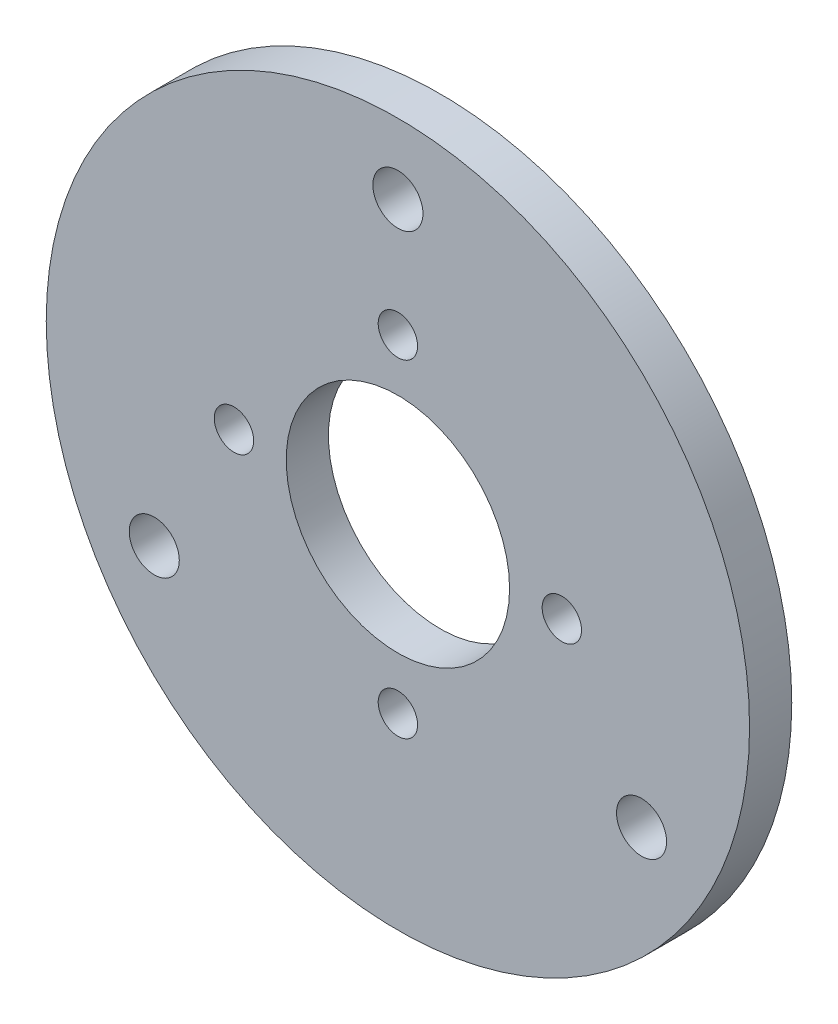
ISO-10303-21;
HEADER;
FILE_DESCRIPTION(('STEP AP214'),'2;1');
FILE_NAME('part.step','',(''),(''),'','','');
FILE_SCHEMA(('AUTOMOTIVE_DESIGN { 1 0 10303 214 1 1 1 1 }'));
ENDSEC;
DATA;
#1=APPLICATION_CONTEXT('core data for automotive mechanical design processes');
#2=APPLICATION_PROTOCOL_DEFINITION('international standard','automotive_design',2000,#1);
#3=PRODUCT_CONTEXT('',#1,'mechanical');
#4=PRODUCT('Part','Part','',(#3));
#5=PRODUCT_RELATED_PRODUCT_CATEGORY('part','',(#4));
#6=PRODUCT_DEFINITION_FORMATION('','',#4);
#7=PRODUCT_DEFINITION_CONTEXT('part definition',#1,'design');
#8=PRODUCT_DEFINITION('design','',#6,#7);
#9=PRODUCT_DEFINITION_SHAPE('','',#8);
#10=(LENGTH_UNIT() NAMED_UNIT(*) SI_UNIT(.MILLI.,.METRE.));
#11=(NAMED_UNIT(*) PLANE_ANGLE_UNIT() SI_UNIT($,.RADIAN.));
#12=(NAMED_UNIT(*) SI_UNIT($,.STERADIAN.) SOLID_ANGLE_UNIT());
#13=UNCERTAINTY_MEASURE_WITH_UNIT(LENGTH_MEASURE(1.E-05),#10,'distance_accuracy_value','');
#14=(GEOMETRIC_REPRESENTATION_CONTEXT(3) GLOBAL_UNCERTAINTY_ASSIGNED_CONTEXT((#13)) GLOBAL_UNIT_ASSIGNED_CONTEXT((#10,
#11,#12)) REPRESENTATION_CONTEXT('',''));
#15=CARTESIAN_POINT('',(0.,0.,0.));
#16=DIRECTION('',(0.,0.,1.));
#17=DIRECTION('',(1.,0.,0.));
#18=AXIS2_PLACEMENT_3D('',#15,#16,#17);
#19=CARTESIAN_POINT('',(0.,0.,1.905));
#20=DIRECTION('',(0.,0.,1.));
#21=DIRECTION('',(1.,0.,0.));
#22=AXIS2_PLACEMENT_3D('',#19,#20,#21);
#23=PLANE('',#22);
#24=CARTESIAN_POINT('',(7.39999999999999,0.,1.905));
#25=DIRECTION('',(0.,0.,1.));
#26=DIRECTION('',(1.,0.,0.));
#27=AXIS2_PLACEMENT_3D('',#24,#25,#26);
#28=CIRCLE('',#27,0.888999999999999);
#29=CARTESIAN_POINT('',(8.28899999999999,0.,1.905));
#30=VERTEX_POINT('',#29);
#31=EDGE_CURVE('E88',#30,#30,#28,.T.);
#32=ORIENTED_EDGE('',*,*,#31,.F.);
#33=EDGE_LOOP('',(#32));
#34=FACE_BOUND('',#33,.T.);
#35=CARTESIAN_POINT('',(0.,-7.39999999999999,1.905));
#36=DIRECTION('',(0.,0.,1.));
#37=DIRECTION('',(1.,0.,0.));
#38=AXIS2_PLACEMENT_3D('',#35,#36,#37);
#39=CIRCLE('',#38,0.888999999999999);
#40=CARTESIAN_POINT('',(0.888999999999999,-7.39999999999999,1.905));
#41=VERTEX_POINT('',#40);
#42=EDGE_CURVE('E82',#41,#41,#39,.T.);
#43=ORIENTED_EDGE('',*,*,#42,.F.);
#44=EDGE_LOOP('',(#43));
#45=FACE_BOUND('',#44,.T.);
#46=CARTESIAN_POINT('',(-7.39999999999999,0.,1.905));
#47=DIRECTION('',(0.,0.,1.));
#48=DIRECTION('',(1.,0.,0.));
#49=AXIS2_PLACEMENT_3D('',#46,#47,#48);
#50=CIRCLE('',#49,0.888999999999999);
#51=CARTESIAN_POINT('',(-6.51099999999999,0.,1.905));
#52=VERTEX_POINT('',#51);
#53=EDGE_CURVE('E76',#52,#52,#50,.T.);
#54=ORIENTED_EDGE('',*,*,#53,.F.);
#55=EDGE_LOOP('',(#54));
#56=FACE_BOUND('',#55,.T.);
#57=CARTESIAN_POINT('',(0.,7.39999999999999,1.905));
#58=DIRECTION('',(0.,0.,1.));
#59=DIRECTION('',(1.,0.,0.));
#60=AXIS2_PLACEMENT_3D('',#57,#58,#59);
#61=CIRCLE('',#60,0.888999999999999);
#62=CARTESIAN_POINT('',(0.888999999999999,7.39999999999999,1.905));
#63=VERTEX_POINT('',#62);
#64=EDGE_CURVE('E70',#63,#63,#61,.T.);
#65=ORIENTED_EDGE('',*,*,#64,.F.);
#66=EDGE_LOOP('',(#65));
#67=FACE_BOUND('',#66,.T.);
#68=CARTESIAN_POINT('',(10.9985226280624,-6.3499999999999,1.905));
#69=DIRECTION('',(0.,0.,1.));
#70=DIRECTION('',(1.,0.,0.));
#71=AXIS2_PLACEMENT_3D('',#68,#69,#70);
#72=CIRCLE('',#71,1.1303);
#73=CARTESIAN_POINT('',(12.1288226280624,-6.3499999999999,1.905));
#74=VERTEX_POINT('',#73);
#75=EDGE_CURVE('E64',#74,#74,#72,.T.);
#76=ORIENTED_EDGE('',*,*,#75,.F.);
#77=EDGE_LOOP('',(#76));
#78=FACE_BOUND('',#77,.T.);
#79=CARTESIAN_POINT('',(-10.9985226280623,-6.35000000000005,1.905));
#80=DIRECTION('',(0.,0.,1.));
#81=DIRECTION('',(1.,0.,0.));
#82=AXIS2_PLACEMENT_3D('',#79,#80,#81);
#83=CIRCLE('',#82,1.1303);
#84=CARTESIAN_POINT('',(-9.86822262806234,-6.35000000000005,1.905));
#85=VERTEX_POINT('',#84);
#86=EDGE_CURVE('E58',#85,#85,#83,.T.);
#87=ORIENTED_EDGE('',*,*,#86,.F.);
#88=EDGE_LOOP('',(#87));
#89=FACE_BOUND('',#88,.T.);
#90=CARTESIAN_POINT('',(0.,12.7,1.905));
#91=DIRECTION('',(0.,0.,1.));
#92=DIRECTION('',(1.,0.,0.));
#93=AXIS2_PLACEMENT_3D('',#90,#91,#92);
#94=CIRCLE('',#93,1.1303);
#95=CARTESIAN_POINT('',(1.1303,12.7,1.905));
#96=VERTEX_POINT('',#95);
#97=EDGE_CURVE('E52',#96,#96,#94,.T.);
#98=ORIENTED_EDGE('',*,*,#97,.F.);
#99=EDGE_LOOP('',(#98));
#100=FACE_BOUND('',#99,.T.);
#101=CARTESIAN_POINT('',(0.,0.,1.905));
#102=DIRECTION('',(0.,0.,1.));
#103=DIRECTION('',(1.,0.,0.));
#104=AXIS2_PLACEMENT_3D('',#101,#102,#103);
#105=CIRCLE('',#104,5.0419);
#106=CARTESIAN_POINT('',(5.0419,0.,1.905));
#107=VERTEX_POINT('',#106);
#108=EDGE_CURVE('E46',#107,#107,#105,.T.);
#109=ORIENTED_EDGE('',*,*,#108,.F.);
#110=EDGE_LOOP('',(#109));
#111=FACE_BOUND('',#110,.T.);
#112=CARTESIAN_POINT('',(0.,0.,1.905));
#113=DIRECTION('',(0.,0.,1.));
#114=DIRECTION('',(1.,0.,0.));
#115=AXIS2_PLACEMENT_3D('',#112,#113,#114);
#116=CIRCLE('',#115,15.875);
#117=CARTESIAN_POINT('',(-15.875,0.,1.905));
#118=VERTEX_POINT('',#117);
#119=EDGE_CURVE('E10',#118,#118,#116,.T.);
#120=ORIENTED_EDGE('',*,*,#119,.T.);
#121=EDGE_LOOP('',(#120));
#122=FACE_BOUND('',#121,.T.);
#123=ADVANCED_FACE('F31',(#34,#45,#56,#67,#78,#89,#100,#111,#122),#23,.T.);
#124=CARTESIAN_POINT('',(0.,0.,0.));
#125=DIRECTION('',(0.,0.,1.));
#126=DIRECTION('',(1.,0.,0.));
#127=AXIS2_PLACEMENT_3D('',#124,#125,#126);
#128=PLANE('',#127);
#129=CARTESIAN_POINT('',(7.39999999999999,0.,0.));
#130=DIRECTION('',(0.,0.,1.));
#131=DIRECTION('',(1.,0.,0.));
#132=AXIS2_PLACEMENT_3D('',#129,#130,#131);
#133=CIRCLE('',#132,0.888999999999998);
#134=CARTESIAN_POINT('',(8.28899999999999,0.,0.));
#135=VERTEX_POINT('',#134);
#136=EDGE_CURVE('E85',#135,#135,#133,.T.);
#137=ORIENTED_EDGE('',*,*,#136,.T.);
#138=EDGE_LOOP('',(#137));
#139=FACE_BOUND('',#138,.T.);
#140=CARTESIAN_POINT('',(0.,-7.39999999999999,0.));
#141=DIRECTION('',(0.,0.,1.));
#142=DIRECTION('',(1.,0.,0.));
#143=AXIS2_PLACEMENT_3D('',#140,#141,#142);
#144=CIRCLE('',#143,0.888999999999999);
#145=CARTESIAN_POINT('',(0.888999999999999,-7.39999999999999,0.));
#146=VERTEX_POINT('',#145);
#147=EDGE_CURVE('E79',#146,#146,#144,.T.);
#148=ORIENTED_EDGE('',*,*,#147,.T.);
#149=EDGE_LOOP('',(#148));
#150=FACE_BOUND('',#149,.T.);
#151=CARTESIAN_POINT('',(-7.39999999999999,0.,0.));
#152=DIRECTION('',(0.,0.,1.));
#153=DIRECTION('',(1.,0.,0.));
#154=AXIS2_PLACEMENT_3D('',#151,#152,#153);
#155=CIRCLE('',#154,0.888999999999999);
#156=CARTESIAN_POINT('',(-6.51099999999999,0.,0.));
#157=VERTEX_POINT('',#156);
#158=EDGE_CURVE('E73',#157,#157,#155,.T.);
#159=ORIENTED_EDGE('',*,*,#158,.T.);
#160=EDGE_LOOP('',(#159));
#161=FACE_BOUND('',#160,.T.);
#162=CARTESIAN_POINT('',(0.,7.39999999999999,0.));
#163=DIRECTION('',(0.,0.,1.));
#164=DIRECTION('',(1.,0.,0.));
#165=AXIS2_PLACEMENT_3D('',#162,#163,#164);
#166=CIRCLE('',#165,0.888999999999999);
#167=CARTESIAN_POINT('',(0.888999999999999,7.39999999999999,0.));
#168=VERTEX_POINT('',#167);
#169=EDGE_CURVE('E67',#168,#168,#166,.T.);
#170=ORIENTED_EDGE('',*,*,#169,.T.);
#171=EDGE_LOOP('',(#170));
#172=FACE_BOUND('',#171,.T.);
#173=CARTESIAN_POINT('',(10.9985226280624,-6.3499999999999,0.));
#174=DIRECTION('',(0.,0.,1.));
#175=DIRECTION('',(1.,0.,0.));
#176=AXIS2_PLACEMENT_3D('',#173,#174,#175);
#177=CIRCLE('',#176,1.1303);
#178=CARTESIAN_POINT('',(12.1288226280624,-6.3499999999999,0.));
#179=VERTEX_POINT('',#178);
#180=EDGE_CURVE('E61',#179,#179,#177,.T.);
#181=ORIENTED_EDGE('',*,*,#180,.T.);
#182=EDGE_LOOP('',(#181));
#183=FACE_BOUND('',#182,.T.);
#184=CARTESIAN_POINT('',(-10.9985226280623,-6.35000000000005,0.));
#185=DIRECTION('',(0.,0.,1.));
#186=DIRECTION('',(1.,0.,0.));
#187=AXIS2_PLACEMENT_3D('',#184,#185,#186);
#188=CIRCLE('',#187,1.1303);
#189=CARTESIAN_POINT('',(-9.86822262806234,-6.35000000000005,0.));
#190=VERTEX_POINT('',#189);
#191=EDGE_CURVE('E55',#190,#190,#188,.T.);
#192=ORIENTED_EDGE('',*,*,#191,.T.);
#193=EDGE_LOOP('',(#192));
#194=FACE_BOUND('',#193,.T.);
#195=CARTESIAN_POINT('',(0.,12.7,0.));
#196=DIRECTION('',(0.,0.,1.));
#197=DIRECTION('',(1.,0.,0.));
#198=AXIS2_PLACEMENT_3D('',#195,#196,#197);
#199=CIRCLE('',#198,1.1303);
#200=CARTESIAN_POINT('',(1.1303,12.7,0.));
#201=VERTEX_POINT('',#200);
#202=EDGE_CURVE('E49',#201,#201,#199,.T.);
#203=ORIENTED_EDGE('',*,*,#202,.T.);
#204=EDGE_LOOP('',(#203));
#205=FACE_BOUND('',#204,.T.);
#206=CARTESIAN_POINT('',(0.,0.,0.));
#207=DIRECTION('',(0.,0.,1.));
#208=DIRECTION('',(1.,0.,0.));
#209=AXIS2_PLACEMENT_3D('',#206,#207,#208);
#210=CIRCLE('',#209,5.0419);
#211=CARTESIAN_POINT('',(5.0419,0.,0.));
#212=VERTEX_POINT('',#211);
#213=EDGE_CURVE('E42',#212,#212,#210,.T.);
#214=ORIENTED_EDGE('',*,*,#213,.T.);
#215=EDGE_LOOP('',(#214));
#216=FACE_BOUND('',#215,.T.);
#217=CARTESIAN_POINT('',(0.,0.,0.));
#218=DIRECTION('',(0.,0.,1.));
#219=DIRECTION('',(1.,0.,0.));
#220=AXIS2_PLACEMENT_3D('',#217,#218,#219);
#221=CIRCLE('',#220,15.875);
#222=CARTESIAN_POINT('',(-15.875,0.,0.));
#223=VERTEX_POINT('',#222);
#224=EDGE_CURVE('E35',#223,#223,#221,.T.);
#225=ORIENTED_EDGE('',*,*,#224,.F.);
#226=EDGE_LOOP('',(#225));
#227=FACE_BOUND('',#226,.T.);
#228=ADVANCED_FACE('F97',(#139,#150,#161,#172,#183,#194,#205,#216,#227),#128,.F.);
#229=CARTESIAN_POINT('',(0.,0.,1.905));
#230=DIRECTION('',(0.,0.,-1.));
#231=DIRECTION('',(-1.,0.,0.));
#232=AXIS2_PLACEMENT_3D('',#229,#230,#231);
#233=CYLINDRICAL_SURFACE('',#232,15.875);
#234=CARTESIAN_POINT('',(-15.875,0.,1.905));
#235=CARTESIAN_POINT('',(-15.875,0.,1.88515625));
#236=CARTESIAN_POINT('',(-15.875,0.,1.8653125));
#237=CARTESIAN_POINT('',(-15.875,0.,1.825625));
#238=CARTESIAN_POINT('',(-15.875,0.,1.80578125));
#239=CARTESIAN_POINT('',(-15.875,0.,1.76609375));
#240=CARTESIAN_POINT('',(-15.875,0.,1.74625));
#241=CARTESIAN_POINT('',(-15.875,0.,1.7065625));
#242=CARTESIAN_POINT('',(-15.875,0.,1.68671875));
#243=CARTESIAN_POINT('',(-15.875,0.,1.64703125));
#244=CARTESIAN_POINT('',(-15.875,0.,1.6271875));
#245=CARTESIAN_POINT('',(-15.875,0.,1.5875));
#246=CARTESIAN_POINT('',(-15.875,0.,1.56765625));
#247=CARTESIAN_POINT('',(-15.875,0.,1.52796875));
#248=CARTESIAN_POINT('',(-15.875,0.,1.508125));
#249=CARTESIAN_POINT('',(-15.875,0.,1.4684375));
#250=CARTESIAN_POINT('',(-15.875,0.,1.44859375));
#251=CARTESIAN_POINT('',(-15.875,0.,1.40890625));
#252=CARTESIAN_POINT('',(-15.875,0.,1.3890625));
#253=CARTESIAN_POINT('',(-15.875,0.,1.349375));
#254=CARTESIAN_POINT('',(-15.875,0.,1.32953125));
#255=CARTESIAN_POINT('',(-15.875,0.,1.28984375));
#256=CARTESIAN_POINT('',(-15.875,0.,1.27));
#257=CARTESIAN_POINT('',(-15.875,0.,1.2303125));
#258=CARTESIAN_POINT('',(-15.875,0.,1.21046875));
#259=CARTESIAN_POINT('',(-15.875,0.,1.17078125));
#260=CARTESIAN_POINT('',(-15.875,0.,1.1509375));
#261=CARTESIAN_POINT('',(-15.875,0.,1.11125));
#262=CARTESIAN_POINT('',(-15.875,0.,1.09140625));
#263=CARTESIAN_POINT('',(-15.875,0.,1.05171875));
#264=CARTESIAN_POINT('',(-15.875,0.,1.031875));
#265=CARTESIAN_POINT('',(-15.875,0.,0.9921875));
#266=CARTESIAN_POINT('',(-15.875,0.,0.97234375));
#267=CARTESIAN_POINT('',(-15.875,0.,0.93265625));
#268=CARTESIAN_POINT('',(-15.875,0.,0.9128125));
#269=CARTESIAN_POINT('',(-15.875,0.,0.873125));
#270=CARTESIAN_POINT('',(-15.875,0.,0.85328125));
#271=CARTESIAN_POINT('',(-15.875,0.,0.81359375));
#272=CARTESIAN_POINT('',(-15.875,0.,0.79375));
#273=CARTESIAN_POINT('',(-15.875,0.,0.7540625));
#274=CARTESIAN_POINT('',(-15.875,0.,0.73421875));
#275=CARTESIAN_POINT('',(-15.875,0.,0.69453125));
#276=CARTESIAN_POINT('',(-15.875,0.,0.6746875));
#277=CARTESIAN_POINT('',(-15.875,0.,0.635));
#278=CARTESIAN_POINT('',(-15.875,0.,0.61515625));
#279=CARTESIAN_POINT('',(-15.875,0.,0.57546875));
#280=CARTESIAN_POINT('',(-15.875,0.,0.555625));
#281=CARTESIAN_POINT('',(-15.875,0.,0.5159375));
#282=CARTESIAN_POINT('',(-15.875,0.,0.49609375));
#283=CARTESIAN_POINT('',(-15.875,0.,0.45640625));
#284=CARTESIAN_POINT('',(-15.875,0.,0.4365625));
#285=CARTESIAN_POINT('',(-15.875,0.,0.396875));
#286=CARTESIAN_POINT('',(-15.875,0.,0.37703125));
#287=CARTESIAN_POINT('',(-15.875,0.,0.33734375));
#288=CARTESIAN_POINT('',(-15.875,0.,0.3175));
#289=CARTESIAN_POINT('',(-15.875,0.,0.2778125));
#290=CARTESIAN_POINT('',(-15.875,0.,0.25796875));
#291=CARTESIAN_POINT('',(-15.875,0.,0.21828125));
#292=CARTESIAN_POINT('',(-15.875,0.,0.1984375));
#293=CARTESIAN_POINT('',(-15.875,0.,0.15875));
#294=CARTESIAN_POINT('',(-15.875,0.,0.13890625));
#295=CARTESIAN_POINT('',(-15.875,0.,0.09921875));
#296=CARTESIAN_POINT('',(-15.875,0.,0.0793749999999999));
#297=CARTESIAN_POINT('',(-15.875,0.,0.0396874999999999));
#298=CARTESIAN_POINT('',(-15.875,0.,0.01984375));
#299=CARTESIAN_POINT('',(-15.875,0.,0.));
#300=B_SPLINE_CURVE_WITH_KNOTS('',3,(#234,#235,#236,#237,#238,#239,#240,#241,#242,#243,#244,
#245,#246,#247,#248,#249,#250,#251,#252,#253,#254,#255,#256,#257,#258,#259,#260,#261,#262,#263,
#264,#265,#266,#267,#268,#269,#270,#271,#272,#273,#274,#275,#276,#277,#278,#279,#280,#281,#282,
#283,#284,#285,#286,#287,#288,#289,#290,#291,#292,#293,#294,#295,#296,#297,#298,#299),
.UNSPECIFIED.,.F.,.F.,(4,2,2,2,2,2,2,2,2,2,2,2,2,2,2,2,2,2,2,2,2,2,2,2,2,2,2,2,2,2,2,2,4),(0.,
0.0595312499999999,0.1190625,0.17859375,0.238125,0.29765625,0.3571875,0.41671875,0.47625,
0.53578125,0.5953125,0.65484375,0.714375,0.77390625,0.833437499999999,0.89296875,0.9525,
1.01203125,1.0715625,1.13109375,1.190625,1.25015625,1.3096875,1.36921875,1.42875,1.48828125,
1.5478125,1.60734375,1.666875,1.72640625,1.7859375,1.84546875,1.905),.UNSPECIFIED.);
#301=EDGE_CURVE('BSEAM33',#118,#223,#300,.T.);
#302=ORIENTED_EDGE('',*,*,#119,.F.);
#303=ORIENTED_EDGE('',*,*,#224,.T.);
#304=ORIENTED_EDGE('',*,*,#301,.T.);
#305=ORIENTED_EDGE('',*,*,#301,.F.);
#306=EDGE_LOOP('',(#302,#304,#303,#305));
#307=FACE_BOUND('',#306,.T.);
#308=ADVANCED_FACE('F33',(#307),#233,.T.);
#309=CARTESIAN_POINT('',(0.,0.,1.905));
#310=DIRECTION('',(0.,0.,1.));
#311=DIRECTION('',(1.,0.,0.));
#312=AXIS2_PLACEMENT_3D('',#309,#310,#311);
#313=CYLINDRICAL_SURFACE('',#312,5.0419);
#314=ORIENTED_EDGE('',*,*,#108,.T.);
#315=EDGE_LOOP('',(#314));
#316=FACE_BOUND('',#315,.T.);
#317=ORIENTED_EDGE('',*,*,#213,.F.);
#318=EDGE_LOOP('',(#317));
#319=FACE_BOUND('',#318,.T.);
#320=ADVANCED_FACE('F113',(#316,#319),#313,.F.);
#321=CARTESIAN_POINT('',(0.,12.7,1.905));
#322=DIRECTION('',(0.,0.,1.));
#323=DIRECTION('',(1.,0.,0.));
#324=AXIS2_PLACEMENT_3D('',#321,#322,#323);
#325=CYLINDRICAL_SURFACE('',#324,1.1303);
#326=ORIENTED_EDGE('',*,*,#97,.T.);
#327=EDGE_LOOP('',(#326));
#328=FACE_BOUND('',#327,.T.);
#329=ORIENTED_EDGE('',*,*,#202,.F.);
#330=EDGE_LOOP('',(#329));
#331=FACE_BOUND('',#330,.T.);
#332=ADVANCED_FACE('F116',(#328,#331),#325,.F.);
#333=CARTESIAN_POINT('',(-10.9985226280623,-6.35000000000005,1.905));
#334=DIRECTION('',(0.,0.,1.));
#335=DIRECTION('',(1.,0.,0.));
#336=AXIS2_PLACEMENT_3D('',#333,#334,#335);
#337=CYLINDRICAL_SURFACE('',#336,1.1303);
#338=ORIENTED_EDGE('',*,*,#86,.T.);
#339=EDGE_LOOP('',(#338));
#340=FACE_BOUND('',#339,.T.);
#341=ORIENTED_EDGE('',*,*,#191,.F.);
#342=EDGE_LOOP('',(#341));
#343=FACE_BOUND('',#342,.T.);
#344=ADVANCED_FACE('F143',(#340,#343),#337,.F.);
#345=CARTESIAN_POINT('',(10.9985226280624,-6.3499999999999,1.905));
#346=DIRECTION('',(0.,0.,1.));
#347=DIRECTION('',(1.,0.,0.));
#348=AXIS2_PLACEMENT_3D('',#345,#346,#347);
#349=CYLINDRICAL_SURFACE('',#348,1.1303);
#350=ORIENTED_EDGE('',*,*,#75,.T.);
#351=EDGE_LOOP('',(#350));
#352=FACE_BOUND('',#351,.T.);
#353=ORIENTED_EDGE('',*,*,#180,.F.);
#354=EDGE_LOOP('',(#353));
#355=FACE_BOUND('',#354,.T.);
#356=ADVANCED_FACE('F151',(#352,#355),#349,.F.);
#357=CARTESIAN_POINT('',(0.,7.39999999999999,1.905));
#358=DIRECTION('',(0.,0.,1.));
#359=DIRECTION('',(1.,0.,0.));
#360=AXIS2_PLACEMENT_3D('',#357,#358,#359);
#361=CYLINDRICAL_SURFACE('',#360,0.888999999999999);
#362=ORIENTED_EDGE('',*,*,#64,.T.);
#363=EDGE_LOOP('',(#362));
#364=FACE_BOUND('',#363,.T.);
#365=ORIENTED_EDGE('',*,*,#169,.F.);
#366=EDGE_LOOP('',(#365));
#367=FACE_BOUND('',#366,.T.);
#368=ADVANCED_FACE('F159',(#364,#367),#361,.F.);
#369=CARTESIAN_POINT('',(-7.39999999999999,0.,1.905));
#370=DIRECTION('',(0.,0.,1.));
#371=DIRECTION('',(1.,0.,0.));
#372=AXIS2_PLACEMENT_3D('',#369,#370,#371);
#373=CYLINDRICAL_SURFACE('',#372,0.888999999999999);
#374=ORIENTED_EDGE('',*,*,#53,.T.);
#375=EDGE_LOOP('',(#374));
#376=FACE_BOUND('',#375,.T.);
#377=ORIENTED_EDGE('',*,*,#158,.F.);
#378=EDGE_LOOP('',(#377));
#379=FACE_BOUND('',#378,.T.);
#380=ADVANCED_FACE('F167',(#376,#379),#373,.F.);
#381=CARTESIAN_POINT('',(0.,-7.39999999999999,1.905));
#382=DIRECTION('',(0.,0.,1.));
#383=DIRECTION('',(1.,0.,0.));
#384=AXIS2_PLACEMENT_3D('',#381,#382,#383);
#385=CYLINDRICAL_SURFACE('',#384,0.888999999999999);
#386=ORIENTED_EDGE('',*,*,#42,.T.);
#387=EDGE_LOOP('',(#386));
#388=FACE_BOUND('',#387,.T.);
#389=ORIENTED_EDGE('',*,*,#147,.F.);
#390=EDGE_LOOP('',(#389));
#391=FACE_BOUND('',#390,.T.);
#392=ADVANCED_FACE('F175',(#388,#391),#385,.F.);
#393=CARTESIAN_POINT('',(7.39999999999999,0.,1.905));
#394=DIRECTION('',(0.,0.,1.));
#395=DIRECTION('',(1.,0.,0.));
#396=AXIS2_PLACEMENT_3D('',#393,#394,#395);
#397=CYLINDRICAL_SURFACE('',#396,0.888999999999998);
#398=ORIENTED_EDGE('',*,*,#31,.T.);
#399=EDGE_LOOP('',(#398));
#400=FACE_BOUND('',#399,.T.);
#401=ORIENTED_EDGE('',*,*,#136,.F.);
#402=EDGE_LOOP('',(#401));
#403=FACE_BOUND('',#402,.T.);
#404=ADVANCED_FACE('F92',(#400,#403),#397,.F.);
#405=CLOSED_SHELL('',(#123,#228,#308,#320,#332,#344,#356,#368,#380,#392,#404));
#406=MANIFOLD_SOLID_BREP('B2',#405);
#407=ADVANCED_BREP_SHAPE_REPRESENTATION('',(#18,#406),#14);
#408=SHAPE_DEFINITION_REPRESENTATION(#9,#407);
ENDSEC;
END-ISO-10303-21;
